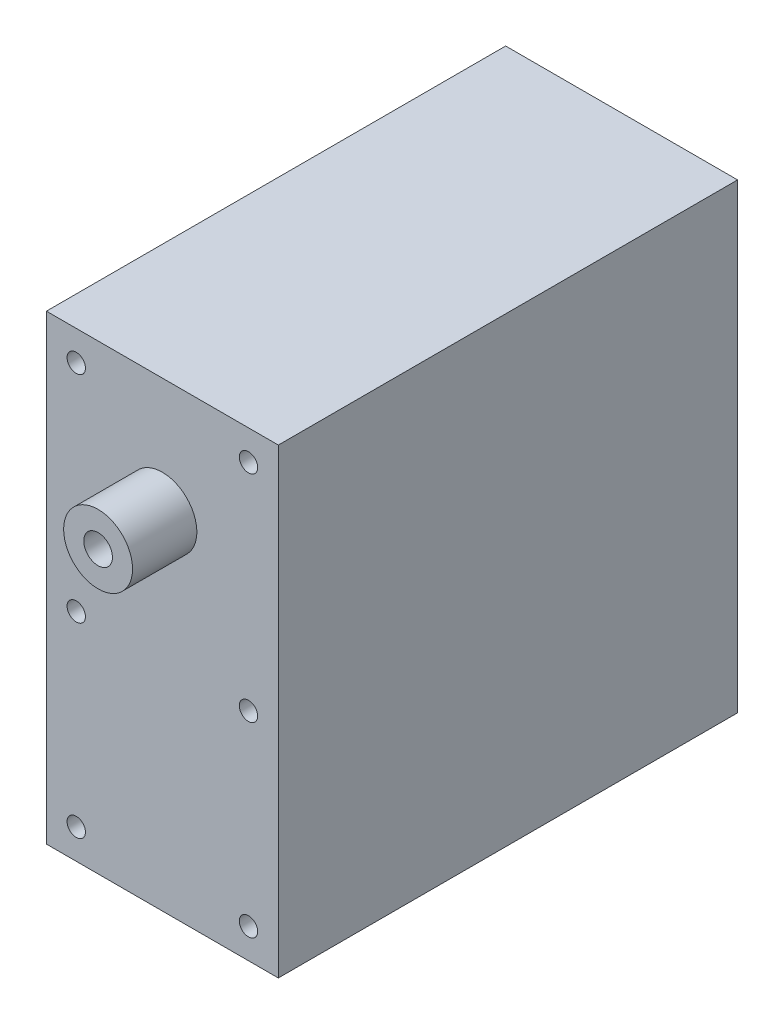
ISO-10303-21;
HEADER;
FILE_DESCRIPTION(('STEP AP214'),'2;1');
FILE_NAME('part.step','',(''),(''),'','','');
FILE_SCHEMA(('AUTOMOTIVE_DESIGN { 1 0 10303 214 1 1 1 1 }'));
ENDSEC;
DATA;
#1=APPLICATION_CONTEXT('core data for automotive mechanical design processes');
#2=APPLICATION_PROTOCOL_DEFINITION('international standard','automotive_design',2000,#1);
#3=PRODUCT_CONTEXT('',#1,'mechanical');
#4=PRODUCT('Part','Part','',(#3));
#5=PRODUCT_RELATED_PRODUCT_CATEGORY('part','',(#4));
#6=PRODUCT_DEFINITION_FORMATION('','',#4);
#7=PRODUCT_DEFINITION_CONTEXT('part definition',#1,'design');
#8=PRODUCT_DEFINITION('design','',#6,#7);
#9=PRODUCT_DEFINITION_SHAPE('','',#8);
#10=(LENGTH_UNIT() NAMED_UNIT(*) SI_UNIT(.MILLI.,.METRE.));
#11=(NAMED_UNIT(*) PLANE_ANGLE_UNIT() SI_UNIT($,.RADIAN.));
#12=(NAMED_UNIT(*) SI_UNIT($,.STERADIAN.) SOLID_ANGLE_UNIT());
#13=UNCERTAINTY_MEASURE_WITH_UNIT(LENGTH_MEASURE(1.E-05),#10,'distance_accuracy_value','');
#14=(GEOMETRIC_REPRESENTATION_CONTEXT(3) GLOBAL_UNCERTAINTY_ASSIGNED_CONTEXT((#13)) GLOBAL_UNIT_ASSIGNED_CONTEXT((#10,
#11,#12)) REPRESENTATION_CONTEXT('',''));
#15=CARTESIAN_POINT('',(0.,0.,0.));
#16=DIRECTION('',(0.,0.,1.));
#17=DIRECTION('',(1.,0.,0.));
#18=AXIS2_PLACEMENT_3D('',#15,#16,#17);
#19=CARTESIAN_POINT('',(10.1,-20.1,40.));
#20=DIRECTION('',(-1.,0.,0.));
#21=DIRECTION('',(0.,0.,1.));
#22=AXIS2_PLACEMENT_3D('',#19,#20,#21);
#23=PLANE('',#22);
#24=DIRECTION('',(0.,1.,0.));
#25=VECTOR('',#24,1.);
#26=CARTESIAN_POINT('',(10.1,-20.1,0.));
#27=LINE('',#26,#25);
#28=CARTESIAN_POINT('',(10.1,-20.1,0.));
#29=VERTEX_POINT('',#28);
#30=CARTESIAN_POINT('',(10.1,20.1,0.));
#31=VERTEX_POINT('',#30);
#32=EDGE_CURVE('E101',#29,#31,#27,.T.);
#33=ORIENTED_EDGE('',*,*,#32,.T.);
#34=DIRECTION('',(0.,0.,-1.));
#35=VECTOR('',#34,1.);
#36=CARTESIAN_POINT('',(10.1,20.1,40.));
#37=LINE('',#36,#35);
#38=CARTESIAN_POINT('',(10.1,20.1,40.));
#39=VERTEX_POINT('',#38);
#40=EDGE_CURVE('E92',#39,#31,#37,.T.);
#41=ORIENTED_EDGE('',*,*,#40,.F.);
#42=DIRECTION('',(0.,1.,0.));
#43=VECTOR('',#42,1.);
#44=CARTESIAN_POINT('',(10.1,-20.1,40.));
#45=LINE('',#44,#43);
#46=CARTESIAN_POINT('',(10.1,-20.1,40.));
#47=VERTEX_POINT('',#46);
#48=EDGE_CURVE('E86',#47,#39,#45,.T.);
#49=ORIENTED_EDGE('',*,*,#48,.F.);
#50=DIRECTION('',(0.,0.,-1.));
#51=VECTOR('',#50,1.);
#52=CARTESIAN_POINT('',(10.1,-20.1,40.));
#53=LINE('',#52,#51);
#54=EDGE_CURVE('E97',#47,#29,#53,.T.);
#55=ORIENTED_EDGE('',*,*,#54,.T.);
#56=EDGE_LOOP('',(#33,#41,#49,#55));
#57=FACE_BOUND('',#56,.T.);
#58=ADVANCED_FACE('F34',(#57),#23,.F.);
#59=CARTESIAN_POINT('',(-10.1,20.1,40.));
#60=DIRECTION('',(0.,-1.,0.));
#61=DIRECTION('',(0.,0.,-1.));
#62=AXIS2_PLACEMENT_3D('',#59,#60,#61);
#63=PLANE('',#62);
#64=DIRECTION('',(-1.,0.,0.));
#65=VECTOR('',#64,1.);
#66=CARTESIAN_POINT('',(-10.1,20.1,0.));
#67=LINE('',#66,#65);
#68=CARTESIAN_POINT('',(-10.1,20.1,0.));
#69=VERTEX_POINT('',#68);
#70=EDGE_CURVE('E91',#31,#69,#67,.T.);
#71=ORIENTED_EDGE('',*,*,#70,.T.);
#72=DIRECTION('',(0.,0.,-1.));
#73=VECTOR('',#72,1.);
#74=CARTESIAN_POINT('',(-10.1,20.1,40.));
#75=LINE('',#74,#73);
#76=CARTESIAN_POINT('',(-10.1,20.1,40.));
#77=VERTEX_POINT('',#76);
#78=EDGE_CURVE('E89',#77,#69,#75,.T.);
#79=ORIENTED_EDGE('',*,*,#78,.F.);
#80=DIRECTION('',(-1.,0.,0.));
#81=VECTOR('',#80,1.);
#82=CARTESIAN_POINT('',(-10.1,20.1,40.));
#83=LINE('',#82,#81);
#84=EDGE_CURVE('E81',#39,#77,#83,.T.);
#85=ORIENTED_EDGE('',*,*,#84,.F.);
#86=ORIENTED_EDGE('',*,*,#40,.T.);
#87=EDGE_LOOP('',(#71,#79,#85,#86));
#88=FACE_BOUND('',#87,.T.);
#89=ADVANCED_FACE('F90',(#88),#63,.F.);
#90=CARTESIAN_POINT('',(-10.1,-20.1,40.));
#91=DIRECTION('',(1.,0.,0.));
#92=DIRECTION('',(0.,0.,-1.));
#93=AXIS2_PLACEMENT_3D('',#90,#91,#92);
#94=PLANE('',#93);
#95=DIRECTION('',(0.,-1.,0.));
#96=VECTOR('',#95,1.);
#97=CARTESIAN_POINT('',(-10.1,-20.1,0.));
#98=LINE('',#97,#96);
#99=CARTESIAN_POINT('',(-10.1,-20.1,0.));
#100=VERTEX_POINT('',#99);
#101=EDGE_CURVE('E67',#69,#100,#98,.T.);
#102=ORIENTED_EDGE('',*,*,#101,.T.);
#103=DIRECTION('',(0.,0.,-1.));
#104=VECTOR('',#103,1.);
#105=CARTESIAN_POINT('',(-10.1,-20.1,40.));
#106=LINE('',#105,#104);
#107=CARTESIAN_POINT('',(-10.1,-20.1,40.));
#108=VERTEX_POINT('',#107);
#109=EDGE_CURVE('E93',#108,#100,#106,.T.);
#110=ORIENTED_EDGE('',*,*,#109,.F.);
#111=DIRECTION('',(0.,-1.,0.));
#112=VECTOR('',#111,1.);
#113=CARTESIAN_POINT('',(-10.1,-20.1,40.));
#114=LINE('',#113,#112);
#115=EDGE_CURVE('E84',#77,#108,#114,.T.);
#116=ORIENTED_EDGE('',*,*,#115,.F.);
#117=ORIENTED_EDGE('',*,*,#78,.T.);
#118=EDGE_LOOP('',(#102,#110,#116,#117));
#119=FACE_BOUND('',#118,.T.);
#120=ADVANCED_FACE('F95',(#119),#94,.F.);
#121=CARTESIAN_POINT('',(-10.1,-20.1,40.));
#122=DIRECTION('',(0.,1.,0.));
#123=DIRECTION('',(0.,0.,1.));
#124=AXIS2_PLACEMENT_3D('',#121,#122,#123);
#125=PLANE('',#124);
#126=DIRECTION('',(1.,0.,0.));
#127=VECTOR('',#126,1.);
#128=CARTESIAN_POINT('',(-10.1,-20.1,0.));
#129=LINE('',#128,#127);
#130=EDGE_CURVE('E73',#100,#29,#129,.T.);
#131=ORIENTED_EDGE('',*,*,#130,.T.);
#132=ORIENTED_EDGE('',*,*,#54,.F.);
#133=DIRECTION('',(1.,0.,0.));
#134=VECTOR('',#133,1.);
#135=CARTESIAN_POINT('',(-10.1,-20.1,40.));
#136=LINE('',#135,#134);
#137=EDGE_CURVE('E50',#108,#47,#136,.T.);
#138=ORIENTED_EDGE('',*,*,#137,.F.);
#139=ORIENTED_EDGE('',*,*,#109,.T.);
#140=EDGE_LOOP('',(#131,#132,#138,#139));
#141=FACE_BOUND('',#140,.T.);
#142=ADVANCED_FACE('F118',(#141),#125,.F.);
#143=CARTESIAN_POINT('',(0.,0.,40.));
#144=DIRECTION('',(0.,0.,-1.));
#145=DIRECTION('',(-1.,0.,0.));
#146=AXIS2_PLACEMENT_3D('',#143,#144,#145);
#147=PLANE('',#146);
#148=CARTESIAN_POINT('',(0.,10.,40.));
#149=DIRECTION('',(0.,0.,-1.));
#150=DIRECTION('',(-1.,0.,0.));
#151=AXIS2_PLACEMENT_3D('',#148,#149,#150);
#152=CIRCLE('',#151,3.);
#153=CARTESIAN_POINT('',(-3.,10.,40.));
#154=VERTEX_POINT('',#153);
#155=EDGE_CURVE('E42',#154,#154,#152,.F.);
#156=ORIENTED_EDGE('',*,*,#155,.F.);
#157=EDGE_LOOP('',(#156));
#158=FACE_BOUND('',#157,.T.);
#159=CARTESIAN_POINT('',(-7.5,-1.25,40.));
#160=DIRECTION('',(0.,0.,1.));
#161=DIRECTION('',(1.,0.,0.));
#162=AXIS2_PLACEMENT_3D('',#159,#160,#161);
#163=CIRCLE('',#162,0.8);
#164=CARTESIAN_POINT('',(-6.69999999999999,-1.25,40.));
#165=VERTEX_POINT('',#164);
#166=EDGE_CURVE('E124',#165,#165,#163,.T.);
#167=ORIENTED_EDGE('',*,*,#166,.F.);
#168=EDGE_LOOP('',(#167));
#169=FACE_BOUND('',#168,.T.);
#170=CARTESIAN_POINT('',(7.49999999999999,17.5,40.));
#171=DIRECTION('',(0.,0.,1.));
#172=DIRECTION('',(1.,0.,0.));
#173=AXIS2_PLACEMENT_3D('',#170,#171,#172);
#174=CIRCLE('',#173,0.8);
#175=CARTESIAN_POINT('',(8.29999999999999,17.5,40.));
#176=VERTEX_POINT('',#175);
#177=EDGE_CURVE('E128',#176,#176,#174,.T.);
#178=ORIENTED_EDGE('',*,*,#177,.F.);
#179=EDGE_LOOP('',(#178));
#180=FACE_BOUND('',#179,.T.);
#181=CARTESIAN_POINT('',(7.49999999999999,-17.5,40.));
#182=DIRECTION('',(0.,0.,1.));
#183=DIRECTION('',(-1.,0.,0.));
#184=AXIS2_PLACEMENT_3D('',#181,#182,#183);
#185=CIRCLE('',#184,0.8);
#186=CARTESIAN_POINT('',(6.69999999999999,-17.5,40.));
#187=VERTEX_POINT('',#186);
#188=EDGE_CURVE('E132',#187,#187,#185,.T.);
#189=ORIENTED_EDGE('',*,*,#188,.F.);
#190=EDGE_LOOP('',(#189));
#191=FACE_BOUND('',#190,.T.);
#192=CARTESIAN_POINT('',(-7.5,17.5,40.));
#193=DIRECTION('',(0.,0.,1.));
#194=DIRECTION('',(-1.,0.,0.));
#195=AXIS2_PLACEMENT_3D('',#192,#193,#194);
#196=CIRCLE('',#195,0.8);
#197=CARTESIAN_POINT('',(-8.3,17.5,40.));
#198=VERTEX_POINT('',#197);
#199=EDGE_CURVE('E136',#198,#198,#196,.T.);
#200=ORIENTED_EDGE('',*,*,#199,.F.);
#201=EDGE_LOOP('',(#200));
#202=FACE_BOUND('',#201,.T.);
#203=CARTESIAN_POINT('',(7.49999999999999,-1.25,40.));
#204=DIRECTION('',(0.,0.,1.));
#205=DIRECTION('',(-1.,0.,0.));
#206=AXIS2_PLACEMENT_3D('',#203,#204,#205);
#207=CIRCLE('',#206,0.8);
#208=CARTESIAN_POINT('',(6.69999999999999,-1.25,40.));
#209=VERTEX_POINT('',#208);
#210=EDGE_CURVE('E140',#209,#209,#207,.T.);
#211=ORIENTED_EDGE('',*,*,#210,.F.);
#212=EDGE_LOOP('',(#211));
#213=FACE_BOUND('',#212,.T.);
#214=CARTESIAN_POINT('',(-7.5,-17.5,40.));
#215=DIRECTION('',(0.,0.,1.));
#216=DIRECTION('',(1.,0.,0.));
#217=AXIS2_PLACEMENT_3D('',#214,#215,#216);
#218=CIRCLE('',#217,0.8);
#219=CARTESIAN_POINT('',(-6.7,-17.5,40.));
#220=VERTEX_POINT('',#219);
#221=EDGE_CURVE('E143',#220,#220,#218,.T.);
#222=ORIENTED_EDGE('',*,*,#221,.F.);
#223=EDGE_LOOP('',(#222));
#224=FACE_BOUND('',#223,.T.);
#225=ORIENTED_EDGE('',*,*,#48,.T.);
#226=ORIENTED_EDGE('',*,*,#84,.T.);
#227=ORIENTED_EDGE('',*,*,#115,.T.);
#228=ORIENTED_EDGE('',*,*,#137,.T.);
#229=EDGE_LOOP('',(#225,#226,#227,#228));
#230=FACE_BOUND('',#229,.T.);
#231=ADVANCED_FACE('F82',(#158,#169,#180,#191,#202,#213,#224,#230),#147,.F.);
#232=CARTESIAN_POINT('',(0.,0.,0.));
#233=DIRECTION('',(0.,0.,-1.));
#234=DIRECTION('',(-1.,0.,0.));
#235=AXIS2_PLACEMENT_3D('',#232,#233,#234);
#236=PLANE('',#235);
#237=CARTESIAN_POINT('',(0.,-17.15,0.));
#238=DIRECTION('',(0.,0.,-1.));
#239=DIRECTION('',(-1.,0.,0.));
#240=AXIS2_PLACEMENT_3D('',#237,#238,#239);
#241=CIRCLE('',#240,0.799999999999999);
#242=CARTESIAN_POINT('',(-0.800000000000004,-17.15,0.));
#243=VERTEX_POINT('',#242);
#244=EDGE_CURVE('E212',#243,#243,#241,.T.);
#245=ORIENTED_EDGE('',*,*,#244,.F.);
#246=EDGE_LOOP('',(#245));
#247=FACE_BOUND('',#246,.T.);
#248=CARTESIAN_POINT('',(7.,-13.15,0.));
#249=DIRECTION('',(0.,0.,-1.));
#250=DIRECTION('',(-1.,0.,0.));
#251=AXIS2_PLACEMENT_3D('',#248,#249,#250);
#252=CIRCLE('',#251,0.800000000000001);
#253=CARTESIAN_POINT('',(6.19999999999999,-13.15,0.));
#254=VERTEX_POINT('',#253);
#255=EDGE_CURVE('E206',#254,#254,#252,.T.);
#256=ORIENTED_EDGE('',*,*,#255,.F.);
#257=EDGE_LOOP('',(#256));
#258=FACE_BOUND('',#257,.T.);
#259=CARTESIAN_POINT('',(6.99999999999999,-10.15,0.));
#260=DIRECTION('',(0.,0.,-1.));
#261=DIRECTION('',(-1.,0.,0.));
#262=AXIS2_PLACEMENT_3D('',#259,#260,#261);
#263=CIRCLE('',#262,0.800000000000001);
#264=CARTESIAN_POINT('',(6.19999999999999,-10.15,0.));
#265=VERTEX_POINT('',#264);
#266=EDGE_CURVE('E200',#265,#265,#263,.T.);
#267=ORIENTED_EDGE('',*,*,#266,.F.);
#268=EDGE_LOOP('',(#267));
#269=FACE_BOUND('',#268,.T.);
#270=CARTESIAN_POINT('',(-7.,-13.15,0.));
#271=DIRECTION('',(0.,0.,-1.));
#272=DIRECTION('',(1.,0.,0.));
#273=AXIS2_PLACEMENT_3D('',#270,#271,#272);
#274=CIRCLE('',#273,0.800000000000001);
#275=CARTESIAN_POINT('',(-6.2,-13.15,0.));
#276=VERTEX_POINT('',#275);
#277=EDGE_CURVE('E194',#276,#276,#274,.T.);
#278=ORIENTED_EDGE('',*,*,#277,.F.);
#279=EDGE_LOOP('',(#278));
#280=FACE_BOUND('',#279,.T.);
#281=CARTESIAN_POINT('',(-7.,-10.15,0.));
#282=DIRECTION('',(0.,0.,-1.));
#283=DIRECTION('',(1.,0.,0.));
#284=AXIS2_PLACEMENT_3D('',#281,#282,#283);
#285=CIRCLE('',#284,0.800000000000001);
#286=CARTESIAN_POINT('',(-6.2,-10.15,0.));
#287=VERTEX_POINT('',#286);
#288=EDGE_CURVE('E188',#287,#287,#285,.T.);
#289=ORIENTED_EDGE('',*,*,#288,.F.);
#290=EDGE_LOOP('',(#289));
#291=FACE_BOUND('',#290,.T.);
#292=CARTESIAN_POINT('',(0.,10.,0.));
#293=DIRECTION('',(0.,0.,-1.));
#294=DIRECTION('',(-1.,0.,0.));
#295=AXIS2_PLACEMENT_3D('',#292,#293,#294);
#296=CIRCLE('',#295,3.);
#297=CARTESIAN_POINT('',(-3.,10.,0.));
#298=VERTEX_POINT('',#297);
#299=EDGE_CURVE('E179',#298,#298,#296,.T.);
#300=ORIENTED_EDGE('',*,*,#299,.F.);
#301=EDGE_LOOP('',(#300));
#302=FACE_BOUND('',#301,.T.);
#303=ORIENTED_EDGE('',*,*,#32,.F.);
#304=ORIENTED_EDGE('',*,*,#130,.F.);
#305=ORIENTED_EDGE('',*,*,#101,.F.);
#306=ORIENTED_EDGE('',*,*,#70,.F.);
#307=EDGE_LOOP('',(#303,#304,#305,#306));
#308=FACE_BOUND('',#307,.T.);
#309=ADVANCED_FACE('F117',(#247,#258,#269,#280,#291,#302,#308),#236,.T.);
#310=CARTESIAN_POINT('',(-7.5,-17.5,35.));
#311=DIRECTION('',(0.,0.,1.));
#312=DIRECTION('',(1.,0.,0.));
#313=AXIS2_PLACEMENT_3D('',#310,#311,#312);
#314=CYLINDRICAL_SURFACE('',#313,0.8);
#315=CARTESIAN_POINT('',(-7.5,-17.5,35.));
#316=DIRECTION('',(0.,0.,1.));
#317=DIRECTION('',(1.,0.,0.));
#318=AXIS2_PLACEMENT_3D('',#315,#316,#317);
#319=CIRCLE('',#318,0.8);
#320=CARTESIAN_POINT('',(-6.7,-17.5,35.));
#321=VERTEX_POINT('',#320);
#322=EDGE_CURVE('E104',#321,#321,#319,.T.);
#323=ORIENTED_EDGE('',*,*,#322,.F.);
#324=EDGE_LOOP('',(#323));
#325=FACE_BOUND('',#324,.T.);
#326=ORIENTED_EDGE('',*,*,#221,.T.);
#327=EDGE_LOOP('',(#326));
#328=FACE_BOUND('',#327,.T.);
#329=ADVANCED_FACE('F229',(#325,#328),#314,.F.);
#330=CARTESIAN_POINT('',(-7.5,-17.5,35.));
#331=DIRECTION('',(0.,0.,1.));
#332=DIRECTION('',(1.,0.,0.));
#333=AXIS2_PLACEMENT_3D('',#330,#331,#332);
#334=PLANE('',#333);
#335=ORIENTED_EDGE('',*,*,#322,.T.);
#336=EDGE_LOOP('',(#335));
#337=FACE_BOUND('',#336,.T.);
#338=ADVANCED_FACE('F522',(#337),#334,.T.);
#339=CARTESIAN_POINT('',(7.49999999999999,-1.25,35.));
#340=DIRECTION('',(0.,0.,1.));
#341=DIRECTION('',(1.,0.,0.));
#342=AXIS2_PLACEMENT_3D('',#339,#340,#341);
#343=CYLINDRICAL_SURFACE('',#342,0.8);
#344=CARTESIAN_POINT('',(7.49999999999999,-1.25,35.));
#345=DIRECTION('',(0.,0.,1.));
#346=DIRECTION('',(-1.,0.,0.));
#347=AXIS2_PLACEMENT_3D('',#344,#345,#346);
#348=CIRCLE('',#347,0.8);
#349=CARTESIAN_POINT('',(6.69999999999999,-1.25,35.));
#350=VERTEX_POINT('',#349);
#351=EDGE_CURVE('E160',#350,#350,#348,.T.);
#352=ORIENTED_EDGE('',*,*,#351,.F.);
#353=EDGE_LOOP('',(#352));
#354=FACE_BOUND('',#353,.T.);
#355=ORIENTED_EDGE('',*,*,#210,.T.);
#356=EDGE_LOOP('',(#355));
#357=FACE_BOUND('',#356,.T.);
#358=ADVANCED_FACE('F513',(#354,#357),#343,.F.);
#359=CARTESIAN_POINT('',(7.49999999999999,-1.25,35.));
#360=DIRECTION('',(0.,0.,-1.));
#361=DIRECTION('',(-1.,0.,0.));
#362=AXIS2_PLACEMENT_3D('',#359,#360,#361);
#363=PLANE('',#362);
#364=ORIENTED_EDGE('',*,*,#351,.T.);
#365=EDGE_LOOP('',(#364));
#366=FACE_BOUND('',#365,.T.);
#367=ADVANCED_FACE('F504',(#366),#363,.F.);
#368=CARTESIAN_POINT('',(-7.5,17.5,35.));
#369=DIRECTION('',(0.,0.,1.));
#370=DIRECTION('',(1.,0.,0.));
#371=AXIS2_PLACEMENT_3D('',#368,#369,#370);
#372=CYLINDRICAL_SURFACE('',#371,0.8);
#373=CARTESIAN_POINT('',(-7.5,17.5,35.));
#374=DIRECTION('',(0.,0.,1.));
#375=DIRECTION('',(-1.,0.,0.));
#376=AXIS2_PLACEMENT_3D('',#373,#374,#375);
#377=CIRCLE('',#376,0.8);
#378=CARTESIAN_POINT('',(-8.3,17.5,35.));
#379=VERTEX_POINT('',#378);
#380=EDGE_CURVE('E145',#379,#379,#377,.T.);
#381=ORIENTED_EDGE('',*,*,#380,.F.);
#382=EDGE_LOOP('',(#381));
#383=FACE_BOUND('',#382,.T.);
#384=ORIENTED_EDGE('',*,*,#199,.T.);
#385=EDGE_LOOP('',(#384));
#386=FACE_BOUND('',#385,.T.);
#387=ADVANCED_FACE('F495',(#383,#386),#372,.F.);
#388=CARTESIAN_POINT('',(-7.5,17.5,35.));
#389=DIRECTION('',(0.,0.,-1.));
#390=DIRECTION('',(-1.,0.,0.));
#391=AXIS2_PLACEMENT_3D('',#388,#389,#390);
#392=PLANE('',#391);
#393=ORIENTED_EDGE('',*,*,#380,.T.);
#394=EDGE_LOOP('',(#393));
#395=FACE_BOUND('',#394,.T.);
#396=ADVANCED_FACE('F486',(#395),#392,.F.);
#397=CARTESIAN_POINT('',(7.49999999999999,-17.5,35.));
#398=DIRECTION('',(0.,0.,1.));
#399=DIRECTION('',(1.,0.,0.));
#400=AXIS2_PLACEMENT_3D('',#397,#398,#399);
#401=CYLINDRICAL_SURFACE('',#400,0.8);
#402=CARTESIAN_POINT('',(7.49999999999999,-17.5,35.));
#403=DIRECTION('',(0.,0.,1.));
#404=DIRECTION('',(-1.,0.,0.));
#405=AXIS2_PLACEMENT_3D('',#402,#403,#404);
#406=CIRCLE('',#405,0.8);
#407=CARTESIAN_POINT('',(6.69999999999999,-17.5,35.));
#408=VERTEX_POINT('',#407);
#409=EDGE_CURVE('E153',#408,#408,#406,.T.);
#410=ORIENTED_EDGE('',*,*,#409,.F.);
#411=EDGE_LOOP('',(#410));
#412=FACE_BOUND('',#411,.T.);
#413=ORIENTED_EDGE('',*,*,#188,.T.);
#414=EDGE_LOOP('',(#413));
#415=FACE_BOUND('',#414,.T.);
#416=ADVANCED_FACE('F477',(#412,#415),#401,.F.);
#417=CARTESIAN_POINT('',(7.49999999999999,-17.5,35.));
#418=DIRECTION('',(0.,0.,-1.));
#419=DIRECTION('',(-1.,0.,0.));
#420=AXIS2_PLACEMENT_3D('',#417,#418,#419);
#421=PLANE('',#420);
#422=ORIENTED_EDGE('',*,*,#409,.T.);
#423=EDGE_LOOP('',(#422));
#424=FACE_BOUND('',#423,.T.);
#425=ADVANCED_FACE('F468',(#424),#421,.F.);
#426=CARTESIAN_POINT('',(7.49999999999999,17.5,35.));
#427=DIRECTION('',(0.,0.,1.));
#428=DIRECTION('',(1.,0.,0.));
#429=AXIS2_PLACEMENT_3D('',#426,#427,#428);
#430=CYLINDRICAL_SURFACE('',#429,0.8);
#431=CARTESIAN_POINT('',(7.49999999999999,17.5,35.));
#432=DIRECTION('',(0.,0.,1.));
#433=DIRECTION('',(1.,0.,0.));
#434=AXIS2_PLACEMENT_3D('',#431,#432,#433);
#435=CIRCLE('',#434,0.8);
#436=CARTESIAN_POINT('',(8.29999999999999,17.5,35.));
#437=VERTEX_POINT('',#436);
#438=EDGE_CURVE('E154',#437,#437,#435,.T.);
#439=ORIENTED_EDGE('',*,*,#438,.F.);
#440=EDGE_LOOP('',(#439));
#441=FACE_BOUND('',#440,.T.);
#442=ORIENTED_EDGE('',*,*,#177,.T.);
#443=EDGE_LOOP('',(#442));
#444=FACE_BOUND('',#443,.T.);
#445=ADVANCED_FACE('F459',(#441,#444),#430,.F.);
#446=CARTESIAN_POINT('',(7.49999999999999,17.5,35.));
#447=DIRECTION('',(0.,0.,1.));
#448=DIRECTION('',(1.,0.,0.));
#449=AXIS2_PLACEMENT_3D('',#446,#447,#448);
#450=PLANE('',#449);
#451=ORIENTED_EDGE('',*,*,#438,.T.);
#452=EDGE_LOOP('',(#451));
#453=FACE_BOUND('',#452,.T.);
#454=ADVANCED_FACE('F450',(#453),#450,.T.);
#455=CARTESIAN_POINT('',(-7.5,-1.25,35.));
#456=DIRECTION('',(0.,0.,1.));
#457=DIRECTION('',(1.,0.,0.));
#458=AXIS2_PLACEMENT_3D('',#455,#456,#457);
#459=CYLINDRICAL_SURFACE('',#458,0.8);
#460=CARTESIAN_POINT('',(-7.5,-1.25,35.));
#461=DIRECTION('',(0.,0.,1.));
#462=DIRECTION('',(1.,0.,0.));
#463=AXIS2_PLACEMENT_3D('',#460,#461,#462);
#464=CIRCLE('',#463,0.8);
#465=CARTESIAN_POINT('',(-6.69999999999999,-1.25,35.));
#466=VERTEX_POINT('',#465);
#467=EDGE_CURVE('E159',#466,#466,#464,.T.);
#468=ORIENTED_EDGE('',*,*,#467,.F.);
#469=EDGE_LOOP('',(#468));
#470=FACE_BOUND('',#469,.T.);
#471=ORIENTED_EDGE('',*,*,#166,.T.);
#472=EDGE_LOOP('',(#471));
#473=FACE_BOUND('',#472,.T.);
#474=ADVANCED_FACE('F441',(#470,#473),#459,.F.);
#475=CARTESIAN_POINT('',(-7.5,-1.25,35.));
#476=DIRECTION('',(0.,0.,1.));
#477=DIRECTION('',(1.,0.,0.));
#478=AXIS2_PLACEMENT_3D('',#475,#476,#477);
#479=PLANE('',#478);
#480=ORIENTED_EDGE('',*,*,#467,.T.);
#481=EDGE_LOOP('',(#480));
#482=FACE_BOUND('',#481,.T.);
#483=ADVANCED_FACE('F426',(#482),#479,.T.);
#484=CARTESIAN_POINT('',(0.,10.,45.6));
#485=DIRECTION('',(0.,0.,1.));
#486=DIRECTION('',(1.,0.,0.));
#487=AXIS2_PLACEMENT_3D('',#484,#485,#486);
#488=PLANE('',#487);
#489=CARTESIAN_POINT('',(0.,10.,45.6));
#490=DIRECTION('',(0.,0.,1.));
#491=DIRECTION('',(1.,0.,0.));
#492=AXIS2_PLACEMENT_3D('',#489,#490,#491);
#493=CIRCLE('',#492,3.);
#494=CARTESIAN_POINT('',(3.,10.,45.6));
#495=VERTEX_POINT('',#494);
#496=EDGE_CURVE('E167',#495,#495,#493,.T.);
#497=ORIENTED_EDGE('',*,*,#496,.T.);
#498=EDGE_LOOP('',(#497));
#499=FACE_BOUND('',#498,.T.);
#500=CARTESIAN_POINT('',(0.,10.,45.6));
#501=DIRECTION('',(0.,0.,1.));
#502=DIRECTION('',(1.,0.,0.));
#503=AXIS2_PLACEMENT_3D('',#500,#501,#502);
#504=CIRCLE('',#503,1.25);
#505=CARTESIAN_POINT('',(1.25,10.,45.6));
#506=VERTEX_POINT('',#505);
#507=EDGE_CURVE('E172',#506,#506,#504,.T.);
#508=ORIENTED_EDGE('',*,*,#507,.F.);
#509=EDGE_LOOP('',(#508));
#510=FACE_BOUND('',#509,.T.);
#511=ADVANCED_FACE('F417',(#499,#510),#488,.T.);
#512=CARTESIAN_POINT('',(0.,10.,45.6));
#513=DIRECTION('',(0.,0.,-1.));
#514=DIRECTION('',(-1.,0.,0.));
#515=AXIS2_PLACEMENT_3D('',#512,#513,#514);
#516=CYLINDRICAL_SURFACE('',#515,3.);
#517=ORIENTED_EDGE('',*,*,#496,.F.);
#518=EDGE_LOOP('',(#517));
#519=FACE_BOUND('',#518,.T.);
#520=ORIENTED_EDGE('',*,*,#155,.T.);
#521=EDGE_LOOP('',(#520));
#522=FACE_BOUND('',#521,.T.);
#523=ADVANCED_FACE('F113',(#519,#522),#516,.T.);
#524=CARTESIAN_POINT('',(0.,10.,45.6));
#525=DIRECTION('',(0.,0.,-1.));
#526=DIRECTION('',(-1.,0.,0.));
#527=AXIS2_PLACEMENT_3D('',#524,#525,#526);
#528=CYLINDRICAL_SURFACE('',#527,1.25);
#529=ORIENTED_EDGE('',*,*,#507,.T.);
#530=EDGE_LOOP('',(#529));
#531=FACE_BOUND('',#530,.T.);
#532=CARTESIAN_POINT('',(0.,10.,40.));
#533=DIRECTION('',(0.,0.,1.));
#534=DIRECTION('',(1.,0.,0.));
#535=AXIS2_PLACEMENT_3D('',#532,#533,#534);
#536=CIRCLE('',#535,1.25);
#537=CARTESIAN_POINT('',(1.25,10.,40.));
#538=VERTEX_POINT('',#537);
#539=EDGE_CURVE('E173',#538,#538,#536,.T.);
#540=ORIENTED_EDGE('',*,*,#539,.F.);
#541=EDGE_LOOP('',(#540));
#542=FACE_BOUND('',#541,.T.);
#543=ADVANCED_FACE('F403',(#531,#542),#528,.F.);
#544=ORIENTED_EDGE('',*,*,#539,.T.);
#545=EDGE_LOOP('',(#544));
#546=FACE_BOUND('',#545,.T.);
#547=ADVANCED_FACE('F120',(#546),#147,.F.);
#548=CARTESIAN_POINT('',(0.,10.,-5.7));
#549=DIRECTION('',(0.,0.,-1.));
#550=DIRECTION('',(-1.,0.,0.));
#551=AXIS2_PLACEMENT_3D('',#548,#549,#550);
#552=PLANE('',#551);
#553=CARTESIAN_POINT('',(0.,10.,-5.7));
#554=DIRECTION('',(0.,0.,-1.));
#555=DIRECTION('',(-1.,0.,0.));
#556=AXIS2_PLACEMENT_3D('',#553,#554,#555);
#557=CIRCLE('',#556,3.);
#558=CARTESIAN_POINT('',(-3.,10.,-5.7));
#559=VERTEX_POINT('',#558);
#560=EDGE_CURVE('E176',#559,#559,#557,.T.);
#561=ORIENTED_EDGE('',*,*,#560,.T.);
#562=EDGE_LOOP('',(#561));
#563=FACE_BOUND('',#562,.T.);
#564=CARTESIAN_POINT('',(0.,10.,-5.7));
#565=DIRECTION('',(0.,0.,-1.));
#566=DIRECTION('',(-1.,0.,0.));
#567=AXIS2_PLACEMENT_3D('',#564,#565,#566);
#568=CIRCLE('',#567,1.5);
#569=CARTESIAN_POINT('',(-1.5,10.,-5.7));
#570=VERTEX_POINT('',#569);
#571=EDGE_CURVE('E182',#570,#570,#568,.T.);
#572=ORIENTED_EDGE('',*,*,#571,.F.);
#573=EDGE_LOOP('',(#572));
#574=FACE_BOUND('',#573,.T.);
#575=ADVANCED_FACE('F272',(#563,#574),#552,.T.);
#576=CARTESIAN_POINT('',(0.,10.,-5.7));
#577=DIRECTION('',(0.,0.,1.));
#578=DIRECTION('',(1.,0.,0.));
#579=AXIS2_PLACEMENT_3D('',#576,#577,#578);
#580=CYLINDRICAL_SURFACE('',#579,3.);
#581=ORIENTED_EDGE('',*,*,#560,.F.);
#582=EDGE_LOOP('',(#581));
#583=FACE_BOUND('',#582,.T.);
#584=ORIENTED_EDGE('',*,*,#299,.T.);
#585=EDGE_LOOP('',(#584));
#586=FACE_BOUND('',#585,.T.);
#587=ADVANCED_FACE('F267',(#583,#586),#580,.T.);
#588=CARTESIAN_POINT('',(0.,10.,-5.7));
#589=DIRECTION('',(0.,0.,1.));
#590=DIRECTION('',(1.,0.,0.));
#591=AXIS2_PLACEMENT_3D('',#588,#589,#590);
#592=CYLINDRICAL_SURFACE('',#591,1.5);
#593=ORIENTED_EDGE('',*,*,#571,.T.);
#594=EDGE_LOOP('',(#593));
#595=FACE_BOUND('',#594,.T.);
#596=CARTESIAN_POINT('',(0.,10.,0.));
#597=DIRECTION('',(0.,0.,-1.));
#598=DIRECTION('',(-1.,0.,0.));
#599=AXIS2_PLACEMENT_3D('',#596,#597,#598);
#600=CIRCLE('',#599,1.5);
#601=CARTESIAN_POINT('',(-1.5,10.,0.));
#602=VERTEX_POINT('',#601);
#603=EDGE_CURVE('E11',#602,#602,#600,.F.);
#604=ORIENTED_EDGE('',*,*,#603,.T.);
#605=EDGE_LOOP('',(#604));
#606=FACE_BOUND('',#605,.T.);
#607=ADVANCED_FACE('F271',(#595,#606),#592,.F.);
#608=ORIENTED_EDGE('',*,*,#603,.F.);
#609=EDGE_LOOP('',(#608));
#610=FACE_BOUND('',#609,.T.);
#611=ADVANCED_FACE('F231',(#610),#236,.T.);
#612=CARTESIAN_POINT('',(-7.,-10.15,5.));
#613=DIRECTION('',(0.,0.,-1.));
#614=DIRECTION('',(-1.,0.,0.));
#615=AXIS2_PLACEMENT_3D('',#612,#613,#614);
#616=CYLINDRICAL_SURFACE('',#615,0.800000000000001);
#617=CARTESIAN_POINT('',(-7.,-10.15,5.));
#618=DIRECTION('',(0.,0.,-1.));
#619=DIRECTION('',(1.,0.,0.));
#620=AXIS2_PLACEMENT_3D('',#617,#618,#619);
#621=CIRCLE('',#620,0.800000000000001);
#622=CARTESIAN_POINT('',(-6.2,-10.15,5.));
#623=VERTEX_POINT('',#622);
#624=EDGE_CURVE('E191',#623,#623,#621,.T.);
#625=ORIENTED_EDGE('',*,*,#624,.F.);
#626=EDGE_LOOP('',(#625));
#627=FACE_BOUND('',#626,.T.);
#628=ORIENTED_EDGE('',*,*,#288,.T.);
#629=EDGE_LOOP('',(#628));
#630=FACE_BOUND('',#629,.T.);
#631=ADVANCED_FACE('F293',(#627,#630),#616,.F.);
#632=CARTESIAN_POINT('',(-7.,-10.15,5.));
#633=DIRECTION('',(0.,0.,1.));
#634=DIRECTION('',(1.,0.,0.));
#635=AXIS2_PLACEMENT_3D('',#632,#633,#634);
#636=PLANE('',#635);
#637=ORIENTED_EDGE('',*,*,#624,.T.);
#638=EDGE_LOOP('',(#637));
#639=FACE_BOUND('',#638,.T.);
#640=ADVANCED_FACE('F301',(#639),#636,.F.);
#641=CARTESIAN_POINT('',(-7.,-13.15,5.));
#642=DIRECTION('',(0.,0.,-1.));
#643=DIRECTION('',(-1.,0.,0.));
#644=AXIS2_PLACEMENT_3D('',#641,#642,#643);
#645=CYLINDRICAL_SURFACE('',#644,0.800000000000001);
#646=CARTESIAN_POINT('',(-7.,-13.15,5.));
#647=DIRECTION('',(0.,0.,-1.));
#648=DIRECTION('',(1.,0.,0.));
#649=AXIS2_PLACEMENT_3D('',#646,#647,#648);
#650=CIRCLE('',#649,0.800000000000001);
#651=CARTESIAN_POINT('',(-6.2,-13.15,5.));
#652=VERTEX_POINT('',#651);
#653=EDGE_CURVE('E197',#652,#652,#650,.T.);
#654=ORIENTED_EDGE('',*,*,#653,.F.);
#655=EDGE_LOOP('',(#654));
#656=FACE_BOUND('',#655,.T.);
#657=ORIENTED_EDGE('',*,*,#277,.T.);
#658=EDGE_LOOP('',(#657));
#659=FACE_BOUND('',#658,.T.);
#660=ADVANCED_FACE('F309',(#656,#659),#645,.F.);
#661=CARTESIAN_POINT('',(-7.,-13.15,5.));
#662=DIRECTION('',(0.,0.,1.));
#663=DIRECTION('',(1.,0.,0.));
#664=AXIS2_PLACEMENT_3D('',#661,#662,#663);
#665=PLANE('',#664);
#666=ORIENTED_EDGE('',*,*,#653,.T.);
#667=EDGE_LOOP('',(#666));
#668=FACE_BOUND('',#667,.T.);
#669=ADVANCED_FACE('F317',(#668),#665,.F.);
#670=CARTESIAN_POINT('',(6.99999999999999,-10.15,5.));
#671=DIRECTION('',(0.,0.,-1.));
#672=DIRECTION('',(-1.,0.,0.));
#673=AXIS2_PLACEMENT_3D('',#670,#671,#672);
#674=CYLINDRICAL_SURFACE('',#673,0.800000000000001);
#675=CARTESIAN_POINT('',(6.99999999999999,-10.15,5.));
#676=DIRECTION('',(0.,0.,-1.));
#677=DIRECTION('',(-1.,0.,0.));
#678=AXIS2_PLACEMENT_3D('',#675,#676,#677);
#679=CIRCLE('',#678,0.800000000000001);
#680=CARTESIAN_POINT('',(6.19999999999999,-10.15,5.));
#681=VERTEX_POINT('',#680);
#682=EDGE_CURVE('E203',#681,#681,#679,.T.);
#683=ORIENTED_EDGE('',*,*,#682,.F.);
#684=EDGE_LOOP('',(#683));
#685=FACE_BOUND('',#684,.T.);
#686=ORIENTED_EDGE('',*,*,#266,.T.);
#687=EDGE_LOOP('',(#686));
#688=FACE_BOUND('',#687,.T.);
#689=ADVANCED_FACE('F325',(#685,#688),#674,.F.);
#690=CARTESIAN_POINT('',(6.99999999999999,-10.15,5.));
#691=DIRECTION('',(0.,0.,-1.));
#692=DIRECTION('',(-1.,0.,0.));
#693=AXIS2_PLACEMENT_3D('',#690,#691,#692);
#694=PLANE('',#693);
#695=ORIENTED_EDGE('',*,*,#682,.T.);
#696=EDGE_LOOP('',(#695));
#697=FACE_BOUND('',#696,.T.);
#698=ADVANCED_FACE('F333',(#697),#694,.T.);
#699=CARTESIAN_POINT('',(7.,-13.15,5.));
#700=DIRECTION('',(0.,0.,-1.));
#701=DIRECTION('',(-1.,0.,0.));
#702=AXIS2_PLACEMENT_3D('',#699,#700,#701);
#703=CYLINDRICAL_SURFACE('',#702,0.800000000000001);
#704=CARTESIAN_POINT('',(7.,-13.15,5.));
#705=DIRECTION('',(0.,0.,-1.));
#706=DIRECTION('',(-1.,0.,0.));
#707=AXIS2_PLACEMENT_3D('',#704,#705,#706);
#708=CIRCLE('',#707,0.800000000000001);
#709=CARTESIAN_POINT('',(6.19999999999999,-13.15,5.));
#710=VERTEX_POINT('',#709);
#711=EDGE_CURVE('E209',#710,#710,#708,.T.);
#712=ORIENTED_EDGE('',*,*,#711,.F.);
#713=EDGE_LOOP('',(#712));
#714=FACE_BOUND('',#713,.T.);
#715=ORIENTED_EDGE('',*,*,#255,.T.);
#716=EDGE_LOOP('',(#715));
#717=FACE_BOUND('',#716,.T.);
#718=ADVANCED_FACE('F341',(#714,#717),#703,.F.);
#719=CARTESIAN_POINT('',(7.,-13.15,5.));
#720=DIRECTION('',(0.,0.,-1.));
#721=DIRECTION('',(-1.,0.,0.));
#722=AXIS2_PLACEMENT_3D('',#719,#720,#721);
#723=PLANE('',#722);
#724=ORIENTED_EDGE('',*,*,#711,.T.);
#725=EDGE_LOOP('',(#724));
#726=FACE_BOUND('',#725,.T.);
#727=ADVANCED_FACE('F223',(#726),#723,.T.);
#728=CARTESIAN_POINT('',(0.,-17.15,5.));
#729=DIRECTION('',(0.,0.,-1.));
#730=DIRECTION('',(-1.,0.,0.));
#731=AXIS2_PLACEMENT_3D('',#728,#729,#730);
#732=CYLINDRICAL_SURFACE('',#731,0.799999999999999);
#733=CARTESIAN_POINT('',(0.,-17.15,5.));
#734=DIRECTION('',(0.,0.,-1.));
#735=DIRECTION('',(-1.,0.,0.));
#736=AXIS2_PLACEMENT_3D('',#733,#734,#735);
#737=CIRCLE('',#736,0.799999999999999);
#738=CARTESIAN_POINT('',(-0.800000000000004,-17.15,5.));
#739=VERTEX_POINT('',#738);
#740=EDGE_CURVE('E187',#739,#739,#737,.T.);
#741=ORIENTED_EDGE('',*,*,#740,.F.);
#742=EDGE_LOOP('',(#741));
#743=FACE_BOUND('',#742,.T.);
#744=ORIENTED_EDGE('',*,*,#244,.T.);
#745=EDGE_LOOP('',(#744));
#746=FACE_BOUND('',#745,.T.);
#747=ADVANCED_FACE('F220',(#743,#746),#732,.F.);
#748=CARTESIAN_POINT('',(0.,-17.15,5.));
#749=DIRECTION('',(0.,0.,-1.));
#750=DIRECTION('',(-1.,0.,0.));
#751=AXIS2_PLACEMENT_3D('',#748,#749,#750);
#752=PLANE('',#751);
#753=ORIENTED_EDGE('',*,*,#740,.T.);
#754=EDGE_LOOP('',(#753));
#755=FACE_BOUND('',#754,.T.);
#756=ADVANCED_FACE('F218',(#755),#752,.T.);
#757=CLOSED_SHELL('',(#58,#89,#120,#142,#231,#309,#329,#338,#358,#367,#387,#396,#416,#425,#445,
#454,#474,#483,#511,#523,#543,#547,#575,#587,#607,#611,#631,#640,#660,#669,#689,#698,#718,#727,
#747,#756));
#758=MANIFOLD_SOLID_BREP('B2',#757);
#759=ADVANCED_BREP_SHAPE_REPRESENTATION('',(#18,#758),#14);
#760=SHAPE_DEFINITION_REPRESENTATION(#9,#759);
ENDSEC;
END-ISO-10303-21;
